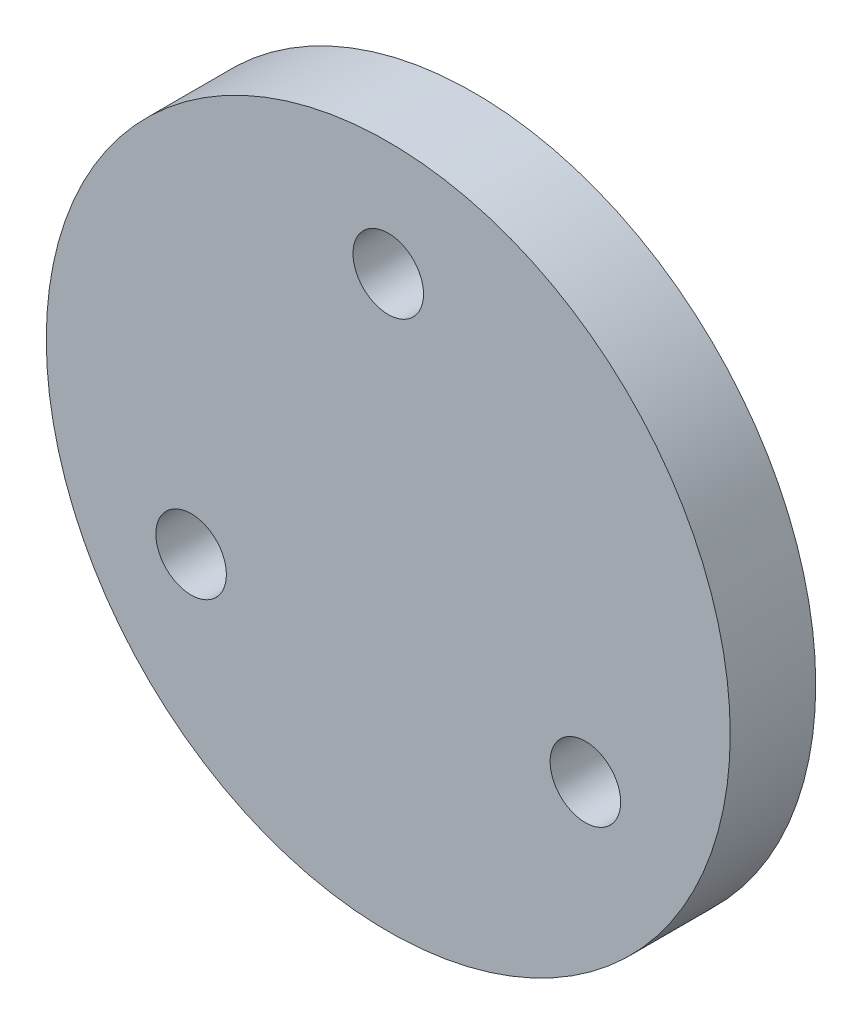
ISO-10303-21;
HEADER;
FILE_DESCRIPTION(('STEP AP214'),'2;1');
FILE_NAME('part.step','',(''),(''),'','','');
FILE_SCHEMA(('AUTOMOTIVE_DESIGN { 1 0 10303 214 1 1 1 1 }'));
ENDSEC;
DATA;
#1=APPLICATION_CONTEXT('core data for automotive mechanical design processes');
#2=APPLICATION_PROTOCOL_DEFINITION('international standard','automotive_design',2000,#1);
#3=PRODUCT_CONTEXT('',#1,'mechanical');
#4=PRODUCT('Part','Part','',(#3));
#5=PRODUCT_RELATED_PRODUCT_CATEGORY('part','',(#4));
#6=PRODUCT_DEFINITION_FORMATION('','',#4);
#7=PRODUCT_DEFINITION_CONTEXT('part definition',#1,'design');
#8=PRODUCT_DEFINITION('design','',#6,#7);
#9=PRODUCT_DEFINITION_SHAPE('','',#8);
#10=(LENGTH_UNIT() NAMED_UNIT(*) SI_UNIT(.MILLI.,.METRE.));
#11=(NAMED_UNIT(*) PLANE_ANGLE_UNIT() SI_UNIT($,.RADIAN.));
#12=(NAMED_UNIT(*) SI_UNIT($,.STERADIAN.) SOLID_ANGLE_UNIT());
#13=UNCERTAINTY_MEASURE_WITH_UNIT(LENGTH_MEASURE(1.E-05),#10,'distance_accuracy_value','');
#14=(GEOMETRIC_REPRESENTATION_CONTEXT(3) GLOBAL_UNCERTAINTY_ASSIGNED_CONTEXT((#13)) GLOBAL_UNIT_ASSIGNED_CONTEXT((#10,
#11,#12)) REPRESENTATION_CONTEXT('',''));
#15=CARTESIAN_POINT('',(0.,0.,0.));
#16=DIRECTION('',(0.,0.,1.));
#17=DIRECTION('',(1.,0.,0.));
#18=AXIS2_PLACEMENT_3D('',#15,#16,#17);
#19=CARTESIAN_POINT('',(0.,0.,4.));
#20=DIRECTION('',(0.,0.,1.));
#21=DIRECTION('',(1.,0.,0.));
#22=AXIS2_PLACEMENT_3D('',#19,#20,#21);
#23=PLANE('',#22);
#24=CARTESIAN_POINT('',(0.,10.65,4.));
#25=DIRECTION('',(0.,0.,1.));
#26=DIRECTION('',(1.,0.,0.));
#27=AXIS2_PLACEMENT_3D('',#24,#25,#26);
#28=CIRCLE('',#27,1.65);
#29=CARTESIAN_POINT('',(1.65,10.65,4.));
#30=VERTEX_POINT('',#29);
#31=EDGE_CURVE('E62',#30,#30,#28,.T.);
#32=ORIENTED_EDGE('',*,*,#31,.F.);
#33=EDGE_LOOP('',(#32));
#34=FACE_BOUND('',#33,.T.);
#35=CARTESIAN_POINT('',(0.,0.,4.));
#36=DIRECTION('',(0.,0.,1.));
#37=DIRECTION('',(1.,0.,0.));
#38=AXIS2_PLACEMENT_3D('',#35,#36,#37);
#39=CIRCLE('',#38,16.);
#40=CARTESIAN_POINT('',(16.,0.,4.));
#41=VERTEX_POINT('',#40);
#42=EDGE_CURVE('E10',#41,#41,#39,.T.);
#43=ORIENTED_EDGE('',*,*,#42,.T.);
#44=EDGE_LOOP('',(#43));
#45=FACE_BOUND('',#44,.T.);
#46=CARTESIAN_POINT('',(9.22317055030429,-5.32499999999997,4.));
#47=DIRECTION('',(0.,0.,1.));
#48=DIRECTION('',(1.,0.,0.));
#49=AXIS2_PLACEMENT_3D('',#46,#47,#48);
#50=CIRCLE('',#49,1.65);
#51=CARTESIAN_POINT('',(10.8731705503043,-5.32499999999997,4.));
#52=VERTEX_POINT('',#51);
#53=EDGE_CURVE('E56',#52,#52,#50,.T.);
#54=ORIENTED_EDGE('',*,*,#53,.F.);
#55=EDGE_LOOP('',(#54));
#56=FACE_BOUND('',#55,.T.);
#57=CARTESIAN_POINT('',(-9.22317055030428,-5.32499999999998,4.));
#58=DIRECTION('',(0.,0.,1.));
#59=DIRECTION('',(1.,0.,0.));
#60=AXIS2_PLACEMENT_3D('',#57,#58,#59);
#61=CIRCLE('',#60,1.65);
#62=CARTESIAN_POINT('',(-7.57317055030428,-5.32499999999998,4.));
#63=VERTEX_POINT('',#62);
#64=EDGE_CURVE('E70',#63,#63,#61,.T.);
#65=ORIENTED_EDGE('',*,*,#64,.F.);
#66=EDGE_LOOP('',(#65));
#67=FACE_BOUND('',#66,.T.);
#68=ADVANCED_FACE('F43',(#34,#45,#56,#67),#23,.T.);
#69=CARTESIAN_POINT('',(0.,0.,0.));
#70=DIRECTION('',(0.,0.,1.));
#71=DIRECTION('',(1.,0.,0.));
#72=AXIS2_PLACEMENT_3D('',#69,#70,#71);
#73=PLANE('',#72);
#74=CARTESIAN_POINT('',(0.,0.,0.));
#75=DIRECTION('',(0.,0.,1.));
#76=DIRECTION('',(1.,0.,0.));
#77=AXIS2_PLACEMENT_3D('',#74,#75,#76);
#78=CIRCLE('',#77,16.);
#79=CARTESIAN_POINT('',(16.,0.,0.));
#80=VERTEX_POINT('',#79);
#81=EDGE_CURVE('E47',#80,#80,#78,.T.);
#82=ORIENTED_EDGE('',*,*,#81,.F.);
#83=EDGE_LOOP('',(#82));
#84=FACE_BOUND('',#83,.T.);
#85=CARTESIAN_POINT('',(9.22317055030429,-5.32499999999997,0.));
#86=DIRECTION('',(0.,0.,1.));
#87=DIRECTION('',(1.,0.,0.));
#88=AXIS2_PLACEMENT_3D('',#85,#86,#87);
#89=CIRCLE('',#88,1.65);
#90=CARTESIAN_POINT('',(10.8731705503043,-5.32499999999997,0.));
#91=VERTEX_POINT('',#90);
#92=EDGE_CURVE('E58',#91,#91,#89,.T.);
#93=ORIENTED_EDGE('',*,*,#92,.T.);
#94=EDGE_LOOP('',(#93));
#95=FACE_BOUND('',#94,.T.);
#96=CARTESIAN_POINT('',(0.,10.65,0.));
#97=DIRECTION('',(0.,0.,1.));
#98=DIRECTION('',(1.,0.,0.));
#99=AXIS2_PLACEMENT_3D('',#96,#97,#98);
#100=CIRCLE('',#99,1.65);
#101=CARTESIAN_POINT('',(1.65,10.65,0.));
#102=VERTEX_POINT('',#101);
#103=EDGE_CURVE('E66',#102,#102,#100,.T.);
#104=ORIENTED_EDGE('',*,*,#103,.T.);
#105=EDGE_LOOP('',(#104));
#106=FACE_BOUND('',#105,.T.);
#107=CARTESIAN_POINT('',(-9.22317055030428,-5.32499999999998,0.));
#108=DIRECTION('',(0.,0.,1.));
#109=DIRECTION('',(1.,0.,0.));
#110=AXIS2_PLACEMENT_3D('',#107,#108,#109);
#111=CIRCLE('',#110,1.65);
#112=CARTESIAN_POINT('',(-7.57317055030428,-5.32499999999998,0.));
#113=VERTEX_POINT('',#112);
#114=EDGE_CURVE('E74',#113,#113,#111,.T.);
#115=ORIENTED_EDGE('',*,*,#114,.T.);
#116=EDGE_LOOP('',(#115));
#117=FACE_BOUND('',#116,.T.);
#118=ADVANCED_FACE('F86',(#84,#95,#106,#117),#73,.F.);
#119=CARTESIAN_POINT('',(0.,0.,4.));
#120=DIRECTION('',(0.,0.,-1.));
#121=DIRECTION('',(-1.,0.,0.));
#122=AXIS2_PLACEMENT_3D('',#119,#120,#121);
#123=CYLINDRICAL_SURFACE('',#122,16.);
#124=ORIENTED_EDGE('',*,*,#42,.F.);
#125=EDGE_LOOP('',(#124));
#126=FACE_BOUND('',#125,.T.);
#127=ORIENTED_EDGE('',*,*,#81,.T.);
#128=EDGE_LOOP('',(#127));
#129=FACE_BOUND('',#128,.T.);
#130=ADVANCED_FACE('F45',(#126,#129),#123,.T.);
#131=CARTESIAN_POINT('',(9.22317055030429,-5.32499999999997,4.));
#132=DIRECTION('',(0.,0.,-1.));
#133=DIRECTION('',(-1.,0.,0.));
#134=AXIS2_PLACEMENT_3D('',#131,#132,#133);
#135=CYLINDRICAL_SURFACE('',#134,1.65);
#136=ORIENTED_EDGE('',*,*,#53,.T.);
#137=EDGE_LOOP('',(#136));
#138=FACE_BOUND('',#137,.T.);
#139=ORIENTED_EDGE('',*,*,#92,.F.);
#140=EDGE_LOOP('',(#139));
#141=FACE_BOUND('',#140,.T.);
#142=ADVANCED_FACE('F95',(#138,#141),#135,.F.);
#143=CARTESIAN_POINT('',(0.,10.65,4.));
#144=DIRECTION('',(0.,0.,-1.));
#145=DIRECTION('',(-1.,0.,0.));
#146=AXIS2_PLACEMENT_3D('',#143,#144,#145);
#147=CYLINDRICAL_SURFACE('',#146,1.65);
#148=ORIENTED_EDGE('',*,*,#31,.T.);
#149=EDGE_LOOP('',(#148));
#150=FACE_BOUND('',#149,.T.);
#151=ORIENTED_EDGE('',*,*,#103,.F.);
#152=EDGE_LOOP('',(#151));
#153=FACE_BOUND('',#152,.T.);
#154=ADVANCED_FACE('F98',(#150,#153),#147,.F.);
#155=CARTESIAN_POINT('',(-9.22317055030428,-5.32499999999998,4.));
#156=DIRECTION('',(0.,0.,-1.));
#157=DIRECTION('',(-1.,0.,0.));
#158=AXIS2_PLACEMENT_3D('',#155,#156,#157);
#159=CYLINDRICAL_SURFACE('',#158,1.65);
#160=ORIENTED_EDGE('',*,*,#64,.T.);
#161=EDGE_LOOP('',(#160));
#162=FACE_BOUND('',#161,.T.);
#163=ORIENTED_EDGE('',*,*,#114,.F.);
#164=EDGE_LOOP('',(#163));
#165=FACE_BOUND('',#164,.T.);
#166=ADVANCED_FACE('F82',(#162,#165),#159,.F.);
#167=CLOSED_SHELL('',(#68,#118,#130,#142,#154,#166));
#168=MANIFOLD_SOLID_BREP('B2',#167);
#169=ADVANCED_BREP_SHAPE_REPRESENTATION('',(#18,#168),#14);
#170=SHAPE_DEFINITION_REPRESENTATION(#9,#169);
ENDSEC;
END-ISO-10303-21;
